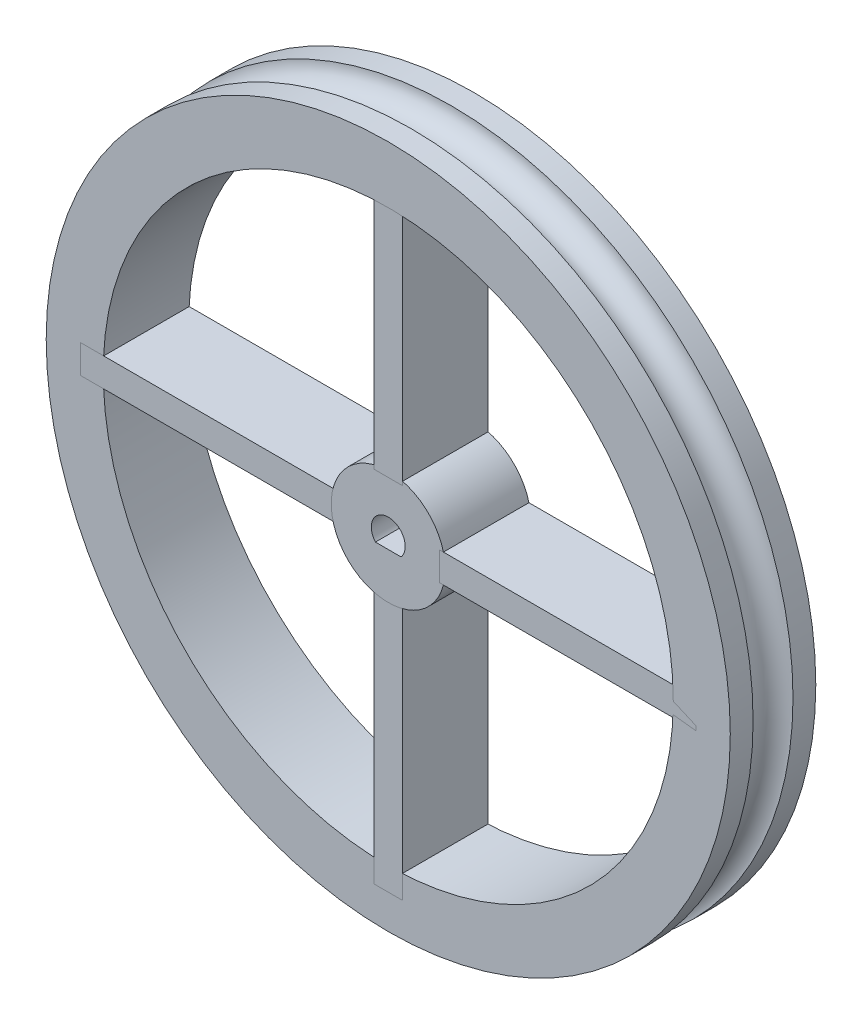
ISO-10303-21;
HEADER;
FILE_DESCRIPTION(('STEP AP214'),'2;1');
FILE_NAME('part.step','',(''),(''),'','','');
FILE_SCHEMA(('AUTOMOTIVE_DESIGN { 1 0 10303 214 1 1 1 1 }'));
ENDSEC;
DATA;
#1=APPLICATION_CONTEXT('core data for automotive mechanical design processes');
#2=APPLICATION_PROTOCOL_DEFINITION('international standard','automotive_design',2000,#1);
#3=PRODUCT_CONTEXT('',#1,'mechanical');
#4=PRODUCT('Part','Part','',(#3));
#5=PRODUCT_RELATED_PRODUCT_CATEGORY('part','',(#4));
#6=PRODUCT_DEFINITION_FORMATION('','',#4);
#7=PRODUCT_DEFINITION_CONTEXT('part definition',#1,'design');
#8=PRODUCT_DEFINITION('design','',#6,#7);
#9=PRODUCT_DEFINITION_SHAPE('','',#8);
#10=(LENGTH_UNIT() NAMED_UNIT(*) SI_UNIT(.MILLI.,.METRE.));
#11=(NAMED_UNIT(*) PLANE_ANGLE_UNIT() SI_UNIT($,.RADIAN.));
#12=(NAMED_UNIT(*) SI_UNIT($,.STERADIAN.) SOLID_ANGLE_UNIT());
#13=UNCERTAINTY_MEASURE_WITH_UNIT(LENGTH_MEASURE(1.E-05),#10,'distance_accuracy_value','');
#14=(GEOMETRIC_REPRESENTATION_CONTEXT(3) GLOBAL_UNCERTAINTY_ASSIGNED_CONTEXT((#13)) GLOBAL_UNIT_ASSIGNED_CONTEXT((#10,
#11,#12)) REPRESENTATION_CONTEXT('',''));
#15=CARTESIAN_POINT('',(0.,0.,0.));
#16=DIRECTION('',(0.,0.,1.));
#17=DIRECTION('',(1.,0.,0.));
#18=AXIS2_PLACEMENT_3D('',#15,#16,#17);
#19=CARTESIAN_POINT('',(27.432,0.,3.81));
#20=DIRECTION('',(1.,0.,0.));
#21=DIRECTION('',(0.,0.,-1.));
#22=AXIS2_PLACEMENT_3D('',#19,#20,#21);
#23=PLANE('',#22);
#24=DIRECTION('',(0.,-1.,0.));
#25=VECTOR('',#24,1.);
#26=CARTESIAN_POINT('',(27.432,0.,-3.81));
#27=LINE('',#26,#25);
#28=CARTESIAN_POINT('',(27.432,1.27,-3.81));
#29=VERTEX_POINT('',#28);
#30=CARTESIAN_POINT('',(27.432,-1.27,-3.81));
#31=VERTEX_POINT('',#30);
#32=EDGE_CURVE('P0_E102',#29,#31,#27,.T.);
#33=ORIENTED_EDGE('',*,*,#32,.F.);
#34=DIRECTION('',(0.,0.,-1.));
#35=VECTOR('',#34,1.);
#36=CARTESIAN_POINT('',(27.432,1.27,3.81));
#37=LINE('',#36,#35);
#38=CARTESIAN_POINT('',(27.432,1.27,3.81));
#39=VERTEX_POINT('',#38);
#40=EDGE_CURVE('P0_E11',#39,#29,#37,.T.);
#41=ORIENTED_EDGE('',*,*,#40,.F.);
#42=DIRECTION('',(0.,-1.,0.));
#43=VECTOR('',#42,1.);
#44=CARTESIAN_POINT('',(27.432,0.,3.81));
#45=LINE('',#44,#43);
#46=CARTESIAN_POINT('',(27.432,-1.27,3.81));
#47=VERTEX_POINT('',#46);
#48=EDGE_CURVE('P0_E80',#39,#47,#45,.T.);
#49=ORIENTED_EDGE('',*,*,#48,.T.);
#50=DIRECTION('',(0.,0.,-1.));
#51=VECTOR('',#50,1.);
#52=CARTESIAN_POINT('',(27.432,-1.27,3.81));
#53=LINE('',#52,#51);
#54=EDGE_CURVE('P0_E39',#47,#31,#53,.T.);
#55=ORIENTED_EDGE('',*,*,#54,.T.);
#56=EDGE_LOOP('',(#33,#41,#49,#55));
#57=FACE_BOUND('',#56,.T.);
#58=ADVANCED_FACE('P0_F17',(#57),#23,.T.);
#59=CARTESIAN_POINT('',(16.002,1.27,3.81));
#60=DIRECTION('',(0.,-1.,0.));
#61=DIRECTION('',(1.,0.,0.));
#62=AXIS2_PLACEMENT_3D('',#59,#60,#61);
#63=PLANE('',#62);
#64=DIRECTION('',(-1.,0.,0.));
#65=VECTOR('',#64,1.);
#66=CARTESIAN_POINT('',(16.002,1.27,-3.81));
#67=LINE('',#66,#65);
#68=CARTESIAN_POINT('',(4.572,1.27,-3.81));
#69=VERTEX_POINT('',#68);
#70=EDGE_CURVE('P0_E87',#29,#69,#67,.T.);
#71=ORIENTED_EDGE('',*,*,#70,.T.);
#72=DIRECTION('',(0.,0.,-1.));
#73=VECTOR('',#72,1.);
#74=CARTESIAN_POINT('',(4.572,1.27,3.81));
#75=LINE('',#74,#73);
#76=CARTESIAN_POINT('',(4.572,1.27,3.81));
#77=VERTEX_POINT('',#76);
#78=EDGE_CURVE('P0_E26',#77,#69,#75,.T.);
#79=ORIENTED_EDGE('',*,*,#78,.F.);
#80=DIRECTION('',(-1.,0.,0.));
#81=VECTOR('',#80,1.);
#82=CARTESIAN_POINT('',(16.002,1.27,3.81));
#83=LINE('',#82,#81);
#84=EDGE_CURVE('P0_E74',#39,#77,#83,.T.);
#85=ORIENTED_EDGE('',*,*,#84,.F.);
#86=ORIENTED_EDGE('',*,*,#40,.T.);
#87=EDGE_LOOP('',(#71,#79,#85,#86));
#88=FACE_BOUND('',#87,.T.);
#89=ADVANCED_FACE('P0_F85',(#88),#63,.F.);
#90=CARTESIAN_POINT('',(4.572,0.,3.81));
#91=DIRECTION('',(1.,0.,0.));
#92=DIRECTION('',(0.,0.,-1.));
#93=AXIS2_PLACEMENT_3D('',#90,#91,#92);
#94=PLANE('',#93);
#95=DIRECTION('',(0.,-1.,0.));
#96=VECTOR('',#95,1.);
#97=CARTESIAN_POINT('',(4.572,0.,-3.81));
#98=LINE('',#97,#96);
#99=CARTESIAN_POINT('',(4.572,-1.27,-3.81));
#100=VERTEX_POINT('',#99);
#101=EDGE_CURVE('P0_E107',#69,#100,#98,.T.);
#102=ORIENTED_EDGE('',*,*,#101,.T.);
#103=DIRECTION('',(0.,0.,-1.));
#104=VECTOR('',#103,1.);
#105=CARTESIAN_POINT('',(4.572,-1.27,3.81));
#106=LINE('',#105,#104);
#107=CARTESIAN_POINT('',(4.572,-1.27,3.81));
#108=VERTEX_POINT('',#107);
#109=EDGE_CURVE('P0_E57',#108,#100,#106,.T.);
#110=ORIENTED_EDGE('',*,*,#109,.F.);
#111=DIRECTION('',(0.,-1.,0.));
#112=VECTOR('',#111,1.);
#113=CARTESIAN_POINT('',(4.572,0.,3.81));
#114=LINE('',#113,#112);
#115=EDGE_CURVE('P0_E79',#77,#108,#114,.T.);
#116=ORIENTED_EDGE('',*,*,#115,.F.);
#117=ORIENTED_EDGE('',*,*,#78,.T.);
#118=EDGE_LOOP('',(#102,#110,#116,#117));
#119=FACE_BOUND('',#118,.T.);
#120=ADVANCED_FACE('P0_F91',(#119),#94,.F.);
#121=CARTESIAN_POINT('',(16.002,-1.27,3.81));
#122=DIRECTION('',(0.,-1.,0.));
#123=DIRECTION('',(1.,0.,0.));
#124=AXIS2_PLACEMENT_3D('',#121,#122,#123);
#125=PLANE('',#124);
#126=DIRECTION('',(-1.,0.,0.));
#127=VECTOR('',#126,1.);
#128=CARTESIAN_POINT('',(16.002,-1.27,-3.81));
#129=LINE('',#128,#127);
#130=EDGE_CURVE('P0_E109',#31,#100,#129,.T.);
#131=ORIENTED_EDGE('',*,*,#130,.F.);
#132=ORIENTED_EDGE('',*,*,#54,.F.);
#133=DIRECTION('',(-1.,0.,0.));
#134=VECTOR('',#133,1.);
#135=CARTESIAN_POINT('',(16.002,-1.27,3.81));
#136=LINE('',#135,#134);
#137=EDGE_CURVE('P0_E93',#47,#108,#136,.T.);
#138=ORIENTED_EDGE('',*,*,#137,.T.);
#139=ORIENTED_EDGE('',*,*,#109,.T.);
#140=EDGE_LOOP('',(#131,#132,#138,#139));
#141=FACE_BOUND('',#140,.T.);
#142=ADVANCED_FACE('P0_F128',(#141),#125,.T.);
#143=CARTESIAN_POINT('',(0.,0.,3.81));
#144=DIRECTION('',(0.,0.,1.));
#145=DIRECTION('',(1.,0.,0.));
#146=AXIS2_PLACEMENT_3D('',#143,#144,#145);
#147=PLANE('',#146);
#148=ORIENTED_EDGE('',*,*,#48,.F.);
#149=ORIENTED_EDGE('',*,*,#84,.T.);
#150=ORIENTED_EDGE('',*,*,#115,.T.);
#151=ORIENTED_EDGE('',*,*,#137,.F.);
#152=EDGE_LOOP('',(#148,#149,#150,#151));
#153=FACE_BOUND('',#152,.T.);
#154=ADVANCED_FACE('P0_F76',(#153),#147,.T.);
#155=CARTESIAN_POINT('',(0.,0.,-3.81));
#156=DIRECTION('',(0.,0.,1.));
#157=DIRECTION('',(1.,0.,0.));
#158=AXIS2_PLACEMENT_3D('',#155,#156,#157);
#159=PLANE('',#158);
#160=ORIENTED_EDGE('',*,*,#32,.T.);
#161=ORIENTED_EDGE('',*,*,#130,.T.);
#162=ORIENTED_EDGE('',*,*,#101,.F.);
#163=ORIENTED_EDGE('',*,*,#70,.F.);
#164=EDGE_LOOP('',(#160,#161,#162,#163));
#165=FACE_BOUND('',#164,.T.);
#166=ADVANCED_FACE('P0_F136',(#165),#159,.F.);
#167=CLOSED_SHELL('',(#58,#89,#120,#142,#154,#166));
#168=MANIFOLD_SOLID_BREP('P0_B1',#167);
#169=CARTESIAN_POINT('',(-4.572,0.,3.81));
#170=DIRECTION('',(1.,0.,0.));
#171=DIRECTION('',(0.,1.,0.));
#172=AXIS2_PLACEMENT_3D('',#169,#170,#171);
#173=PLANE('',#172);
#174=DIRECTION('',(0.,-1.,0.));
#175=VECTOR('',#174,1.);
#176=CARTESIAN_POINT('',(-4.572,0.,-3.81));
#177=LINE('',#176,#175);
#178=CARTESIAN_POINT('',(-4.572,1.27,-3.81));
#179=VERTEX_POINT('',#178);
#180=CARTESIAN_POINT('',(-4.572,-1.27,-3.81));
#181=VERTEX_POINT('',#180);
#182=EDGE_CURVE('P1_E102',#179,#181,#177,.T.);
#183=ORIENTED_EDGE('',*,*,#182,.F.);
#184=DIRECTION('',(0.,0.,-1.));
#185=VECTOR('',#184,1.);
#186=CARTESIAN_POINT('',(-4.572,1.27,3.81));
#187=LINE('',#186,#185);
#188=CARTESIAN_POINT('',(-4.572,1.27,3.81));
#189=VERTEX_POINT('',#188);
#190=EDGE_CURVE('P1_E11',#189,#179,#187,.T.);
#191=ORIENTED_EDGE('',*,*,#190,.F.);
#192=DIRECTION('',(0.,-1.,0.));
#193=VECTOR('',#192,1.);
#194=CARTESIAN_POINT('',(-4.572,0.,3.81));
#195=LINE('',#194,#193);
#196=CARTESIAN_POINT('',(-4.572,-1.27,3.81));
#197=VERTEX_POINT('',#196);
#198=EDGE_CURVE('P1_E80',#189,#197,#195,.T.);
#199=ORIENTED_EDGE('',*,*,#198,.T.);
#200=DIRECTION('',(0.,0.,-1.));
#201=VECTOR('',#200,1.);
#202=CARTESIAN_POINT('',(-4.572,-1.27,3.81));
#203=LINE('',#202,#201);
#204=EDGE_CURVE('P1_E39',#197,#181,#203,.T.);
#205=ORIENTED_EDGE('',*,*,#204,.T.);
#206=EDGE_LOOP('',(#183,#191,#199,#205));
#207=FACE_BOUND('',#206,.T.);
#208=ADVANCED_FACE('P1_F17',(#207),#173,.T.);
#209=CARTESIAN_POINT('',(-16.002,1.27,3.81));
#210=DIRECTION('',(0.,-1.,0.));
#211=DIRECTION('',(1.,0.,0.));
#212=AXIS2_PLACEMENT_3D('',#209,#210,#211);
#213=PLANE('',#212);
#214=DIRECTION('',(-1.,0.,0.));
#215=VECTOR('',#214,1.);
#216=CARTESIAN_POINT('',(-16.002,1.27,-3.81));
#217=LINE('',#216,#215);
#218=CARTESIAN_POINT('',(-27.432,1.27,-3.81));
#219=VERTEX_POINT('',#218);
#220=EDGE_CURVE('P1_E87',#179,#219,#217,.T.);
#221=ORIENTED_EDGE('',*,*,#220,.T.);
#222=DIRECTION('',(0.,0.,-1.));
#223=VECTOR('',#222,1.);
#224=CARTESIAN_POINT('',(-27.432,1.27,3.81));
#225=LINE('',#224,#223);
#226=CARTESIAN_POINT('',(-27.432,1.27,3.81));
#227=VERTEX_POINT('',#226);
#228=EDGE_CURVE('P1_E26',#227,#219,#225,.T.);
#229=ORIENTED_EDGE('',*,*,#228,.F.);
#230=DIRECTION('',(-1.,0.,0.));
#231=VECTOR('',#230,1.);
#232=CARTESIAN_POINT('',(-16.002,1.27,3.81));
#233=LINE('',#232,#231);
#234=EDGE_CURVE('P1_E74',#189,#227,#233,.T.);
#235=ORIENTED_EDGE('',*,*,#234,.F.);
#236=ORIENTED_EDGE('',*,*,#190,.T.);
#237=EDGE_LOOP('',(#221,#229,#235,#236));
#238=FACE_BOUND('',#237,.T.);
#239=ADVANCED_FACE('P1_F85',(#238),#213,.F.);
#240=CARTESIAN_POINT('',(-27.432,0.,3.81));
#241=DIRECTION('',(1.,0.,0.));
#242=DIRECTION('',(0.,0.,-1.));
#243=AXIS2_PLACEMENT_3D('',#240,#241,#242);
#244=PLANE('',#243);
#245=DIRECTION('',(0.,-1.,0.));
#246=VECTOR('',#245,1.);
#247=CARTESIAN_POINT('',(-27.432,0.,-3.81));
#248=LINE('',#247,#246);
#249=CARTESIAN_POINT('',(-27.432,-1.27000000000003,-3.81));
#250=VERTEX_POINT('',#249);
#251=EDGE_CURVE('P1_E107',#219,#250,#248,.T.);
#252=ORIENTED_EDGE('',*,*,#251,.T.);
#253=DIRECTION('',(0.,0.,-1.));
#254=VECTOR('',#253,1.);
#255=CARTESIAN_POINT('',(-27.432,-1.27000000000003,3.81));
#256=LINE('',#255,#254);
#257=CARTESIAN_POINT('',(-27.432,-1.27000000000003,3.81));
#258=VERTEX_POINT('',#257);
#259=EDGE_CURVE('P1_E57',#258,#250,#256,.T.);
#260=ORIENTED_EDGE('',*,*,#259,.F.);
#261=DIRECTION('',(0.,-1.,0.));
#262=VECTOR('',#261,1.);
#263=CARTESIAN_POINT('',(-27.432,0.,3.81));
#264=LINE('',#263,#262);
#265=EDGE_CURVE('P1_E79',#227,#258,#264,.T.);
#266=ORIENTED_EDGE('',*,*,#265,.F.);
#267=ORIENTED_EDGE('',*,*,#228,.T.);
#268=EDGE_LOOP('',(#252,#260,#266,#267));
#269=FACE_BOUND('',#268,.T.);
#270=ADVANCED_FACE('P1_F91',(#269),#244,.F.);
#271=CARTESIAN_POINT('',(-16.002,-1.27,3.81));
#272=DIRECTION('',(0.,-1.,0.));
#273=DIRECTION('',(1.,0.,0.));
#274=AXIS2_PLACEMENT_3D('',#271,#272,#273);
#275=PLANE('',#274);
#276=DIRECTION('',(-1.,0.,0.));
#277=VECTOR('',#276,1.);
#278=CARTESIAN_POINT('',(-16.002,-1.27,-3.81));
#279=LINE('',#278,#277);
#280=EDGE_CURVE('P1_E109',#181,#250,#279,.T.);
#281=ORIENTED_EDGE('',*,*,#280,.F.);
#282=ORIENTED_EDGE('',*,*,#204,.F.);
#283=DIRECTION('',(-1.,0.,0.));
#284=VECTOR('',#283,1.);
#285=CARTESIAN_POINT('',(-16.002,-1.27,3.81));
#286=LINE('',#285,#284);
#287=EDGE_CURVE('P1_E93',#197,#258,#286,.T.);
#288=ORIENTED_EDGE('',*,*,#287,.T.);
#289=ORIENTED_EDGE('',*,*,#259,.T.);
#290=EDGE_LOOP('',(#281,#282,#288,#289));
#291=FACE_BOUND('',#290,.T.);
#292=ADVANCED_FACE('P1_F128',(#291),#275,.T.);
#293=CARTESIAN_POINT('',(0.,0.,3.81));
#294=DIRECTION('',(0.,0.,1.));
#295=DIRECTION('',(1.,0.,0.));
#296=AXIS2_PLACEMENT_3D('',#293,#294,#295);
#297=PLANE('',#296);
#298=ORIENTED_EDGE('',*,*,#198,.F.);
#299=ORIENTED_EDGE('',*,*,#234,.T.);
#300=ORIENTED_EDGE('',*,*,#265,.T.);
#301=ORIENTED_EDGE('',*,*,#287,.F.);
#302=EDGE_LOOP('',(#298,#299,#300,#301));
#303=FACE_BOUND('',#302,.T.);
#304=ADVANCED_FACE('P1_F76',(#303),#297,.T.);
#305=CARTESIAN_POINT('',(0.,0.,-3.81));
#306=DIRECTION('',(0.,0.,1.));
#307=DIRECTION('',(1.,0.,0.));
#308=AXIS2_PLACEMENT_3D('',#305,#306,#307);
#309=PLANE('',#308);
#310=ORIENTED_EDGE('',*,*,#182,.T.);
#311=ORIENTED_EDGE('',*,*,#280,.T.);
#312=ORIENTED_EDGE('',*,*,#251,.F.);
#313=ORIENTED_EDGE('',*,*,#220,.F.);
#314=EDGE_LOOP('',(#310,#311,#312,#313));
#315=FACE_BOUND('',#314,.T.);
#316=ADVANCED_FACE('P1_F136',(#315),#309,.F.);
#317=CLOSED_SHELL('',(#208,#239,#270,#292,#304,#316));
#318=MANIFOLD_SOLID_BREP('P1_B1',#317);
#319=CARTESIAN_POINT('',(1.27,-16.002,3.81));
#320=DIRECTION('',(1.,0.,0.));
#321=DIRECTION('',(0.,1.,0.));
#322=AXIS2_PLACEMENT_3D('',#319,#320,#321);
#323=PLANE('',#322);
#324=DIRECTION('',(0.,-1.,0.));
#325=VECTOR('',#324,1.);
#326=CARTESIAN_POINT('',(1.27,-16.002,-3.81));
#327=LINE('',#326,#325);
#328=CARTESIAN_POINT('',(1.27,-4.572,-3.81));
#329=VERTEX_POINT('',#328);
#330=CARTESIAN_POINT('',(1.27000000000001,-27.432,-3.81));
#331=VERTEX_POINT('',#330);
#332=EDGE_CURVE('P2_E102',#329,#331,#327,.T.);
#333=ORIENTED_EDGE('',*,*,#332,.F.);
#334=DIRECTION('',(0.,0.,-1.));
#335=VECTOR('',#334,1.);
#336=CARTESIAN_POINT('',(1.27,-4.572,3.81));
#337=LINE('',#336,#335);
#338=CARTESIAN_POINT('',(1.27,-4.572,3.81));
#339=VERTEX_POINT('',#338);
#340=EDGE_CURVE('P2_E11',#339,#329,#337,.T.);
#341=ORIENTED_EDGE('',*,*,#340,.F.);
#342=DIRECTION('',(0.,-1.,0.));
#343=VECTOR('',#342,1.);
#344=CARTESIAN_POINT('',(1.27,-16.002,3.81));
#345=LINE('',#344,#343);
#346=CARTESIAN_POINT('',(1.27000000000001,-27.432,3.81));
#347=VERTEX_POINT('',#346);
#348=EDGE_CURVE('P2_E80',#339,#347,#345,.T.);
#349=ORIENTED_EDGE('',*,*,#348,.T.);
#350=DIRECTION('',(0.,0.,-1.));
#351=VECTOR('',#350,1.);
#352=CARTESIAN_POINT('',(1.27000000000001,-27.432,3.81));
#353=LINE('',#352,#351);
#354=EDGE_CURVE('P2_E39',#347,#331,#353,.T.);
#355=ORIENTED_EDGE('',*,*,#354,.T.);
#356=EDGE_LOOP('',(#333,#341,#349,#355));
#357=FACE_BOUND('',#356,.T.);
#358=ADVANCED_FACE('P2_F17',(#357),#323,.T.);
#359=CARTESIAN_POINT('',(0.,-4.572,3.81));
#360=DIRECTION('',(0.,-1.,0.));
#361=DIRECTION('',(0.,0.,-1.));
#362=AXIS2_PLACEMENT_3D('',#359,#360,#361);
#363=PLANE('',#362);
#364=DIRECTION('',(-1.,0.,0.));
#365=VECTOR('',#364,1.);
#366=CARTESIAN_POINT('',(0.,-4.572,-3.81));
#367=LINE('',#366,#365);
#368=CARTESIAN_POINT('',(-1.27,-4.572,-3.81));
#369=VERTEX_POINT('',#368);
#370=EDGE_CURVE('P2_E87',#329,#369,#367,.T.);
#371=ORIENTED_EDGE('',*,*,#370,.T.);
#372=DIRECTION('',(0.,0.,-1.));
#373=VECTOR('',#372,1.);
#374=CARTESIAN_POINT('',(-1.27,-4.572,3.81));
#375=LINE('',#374,#373);
#376=CARTESIAN_POINT('',(-1.27,-4.572,3.81));
#377=VERTEX_POINT('',#376);
#378=EDGE_CURVE('P2_E26',#377,#369,#375,.T.);
#379=ORIENTED_EDGE('',*,*,#378,.F.);
#380=DIRECTION('',(-1.,0.,0.));
#381=VECTOR('',#380,1.);
#382=CARTESIAN_POINT('',(0.,-4.572,3.81));
#383=LINE('',#382,#381);
#384=EDGE_CURVE('P2_E74',#339,#377,#383,.T.);
#385=ORIENTED_EDGE('',*,*,#384,.F.);
#386=ORIENTED_EDGE('',*,*,#340,.T.);
#387=EDGE_LOOP('',(#371,#379,#385,#386));
#388=FACE_BOUND('',#387,.T.);
#389=ADVANCED_FACE('P2_F85',(#388),#363,.F.);
#390=CARTESIAN_POINT('',(-1.27,-16.002,3.81));
#391=DIRECTION('',(1.,0.,0.));
#392=DIRECTION('',(0.,1.,0.));
#393=AXIS2_PLACEMENT_3D('',#390,#391,#392);
#394=PLANE('',#393);
#395=DIRECTION('',(0.,-1.,0.));
#396=VECTOR('',#395,1.);
#397=CARTESIAN_POINT('',(-1.27,-16.002,-3.81));
#398=LINE('',#397,#396);
#399=CARTESIAN_POINT('',(-1.27,-27.432,-3.81));
#400=VERTEX_POINT('',#399);
#401=EDGE_CURVE('P2_E107',#369,#400,#398,.T.);
#402=ORIENTED_EDGE('',*,*,#401,.T.);
#403=DIRECTION('',(0.,0.,-1.));
#404=VECTOR('',#403,1.);
#405=CARTESIAN_POINT('',(-1.27,-27.432,3.81));
#406=LINE('',#405,#404);
#407=CARTESIAN_POINT('',(-1.27,-27.432,3.81));
#408=VERTEX_POINT('',#407);
#409=EDGE_CURVE('P2_E57',#408,#400,#406,.T.);
#410=ORIENTED_EDGE('',*,*,#409,.F.);
#411=DIRECTION('',(0.,-1.,0.));
#412=VECTOR('',#411,1.);
#413=CARTESIAN_POINT('',(-1.27,-16.002,3.81));
#414=LINE('',#413,#412);
#415=EDGE_CURVE('P2_E79',#377,#408,#414,.T.);
#416=ORIENTED_EDGE('',*,*,#415,.F.);
#417=ORIENTED_EDGE('',*,*,#378,.T.);
#418=EDGE_LOOP('',(#402,#410,#416,#417));
#419=FACE_BOUND('',#418,.T.);
#420=ADVANCED_FACE('P2_F91',(#419),#394,.F.);
#421=CARTESIAN_POINT('',(0.,-27.432,3.81));
#422=DIRECTION('',(0.,-1.,0.));
#423=DIRECTION('',(0.,0.,-1.));
#424=AXIS2_PLACEMENT_3D('',#421,#422,#423);
#425=PLANE('',#424);
#426=DIRECTION('',(-1.,0.,0.));
#427=VECTOR('',#426,1.);
#428=CARTESIAN_POINT('',(0.,-27.432,-3.81));
#429=LINE('',#428,#427);
#430=EDGE_CURVE('P2_E109',#331,#400,#429,.T.);
#431=ORIENTED_EDGE('',*,*,#430,.F.);
#432=ORIENTED_EDGE('',*,*,#354,.F.);
#433=DIRECTION('',(-1.,0.,0.));
#434=VECTOR('',#433,1.);
#435=CARTESIAN_POINT('',(0.,-27.432,3.81));
#436=LINE('',#435,#434);
#437=EDGE_CURVE('P2_E93',#347,#408,#436,.T.);
#438=ORIENTED_EDGE('',*,*,#437,.T.);
#439=ORIENTED_EDGE('',*,*,#409,.T.);
#440=EDGE_LOOP('',(#431,#432,#438,#439));
#441=FACE_BOUND('',#440,.T.);
#442=ADVANCED_FACE('P2_F128',(#441),#425,.T.);
#443=CARTESIAN_POINT('',(0.,0.,3.81));
#444=DIRECTION('',(0.,0.,1.));
#445=DIRECTION('',(1.,0.,0.));
#446=AXIS2_PLACEMENT_3D('',#443,#444,#445);
#447=PLANE('',#446);
#448=ORIENTED_EDGE('',*,*,#348,.F.);
#449=ORIENTED_EDGE('',*,*,#384,.T.);
#450=ORIENTED_EDGE('',*,*,#415,.T.);
#451=ORIENTED_EDGE('',*,*,#437,.F.);
#452=EDGE_LOOP('',(#448,#449,#450,#451));
#453=FACE_BOUND('',#452,.T.);
#454=ADVANCED_FACE('P2_F76',(#453),#447,.T.);
#455=CARTESIAN_POINT('',(0.,0.,-3.81));
#456=DIRECTION('',(0.,0.,1.));
#457=DIRECTION('',(1.,0.,0.));
#458=AXIS2_PLACEMENT_3D('',#455,#456,#457);
#459=PLANE('',#458);
#460=ORIENTED_EDGE('',*,*,#332,.T.);
#461=ORIENTED_EDGE('',*,*,#430,.T.);
#462=ORIENTED_EDGE('',*,*,#401,.F.);
#463=ORIENTED_EDGE('',*,*,#370,.F.);
#464=EDGE_LOOP('',(#460,#461,#462,#463));
#465=FACE_BOUND('',#464,.T.);
#466=ADVANCED_FACE('P2_F136',(#465),#459,.F.);
#467=CLOSED_SHELL('',(#358,#389,#420,#442,#454,#466));
#468=MANIFOLD_SOLID_BREP('P2_B1',#467);
#469=CARTESIAN_POINT('',(1.27,16.002,3.81));
#470=DIRECTION('',(1.,0.,0.));
#471=DIRECTION('',(0.,1.,0.));
#472=AXIS2_PLACEMENT_3D('',#469,#470,#471);
#473=PLANE('',#472);
#474=DIRECTION('',(0.,-1.,0.));
#475=VECTOR('',#474,1.);
#476=CARTESIAN_POINT('',(1.27,16.002,-3.81));
#477=LINE('',#476,#475);
#478=CARTESIAN_POINT('',(1.27,27.432,-3.81));
#479=VERTEX_POINT('',#478);
#480=CARTESIAN_POINT('',(1.27,4.572,-3.81));
#481=VERTEX_POINT('',#480);
#482=EDGE_CURVE('P3_E102',#479,#481,#477,.T.);
#483=ORIENTED_EDGE('',*,*,#482,.F.);
#484=DIRECTION('',(0.,0.,-1.));
#485=VECTOR('',#484,1.);
#486=CARTESIAN_POINT('',(1.27,27.432,3.81));
#487=LINE('',#486,#485);
#488=CARTESIAN_POINT('',(1.27,27.432,3.81));
#489=VERTEX_POINT('',#488);
#490=EDGE_CURVE('P3_E11',#489,#479,#487,.T.);
#491=ORIENTED_EDGE('',*,*,#490,.F.);
#492=DIRECTION('',(0.,-1.,0.));
#493=VECTOR('',#492,1.);
#494=CARTESIAN_POINT('',(1.27,16.002,3.81));
#495=LINE('',#494,#493);
#496=CARTESIAN_POINT('',(1.27,4.572,3.81));
#497=VERTEX_POINT('',#496);
#498=EDGE_CURVE('P3_E80',#489,#497,#495,.T.);
#499=ORIENTED_EDGE('',*,*,#498,.T.);
#500=DIRECTION('',(0.,0.,-1.));
#501=VECTOR('',#500,1.);
#502=CARTESIAN_POINT('',(1.27,4.572,3.81));
#503=LINE('',#502,#501);
#504=EDGE_CURVE('P3_E39',#497,#481,#503,.T.);
#505=ORIENTED_EDGE('',*,*,#504,.T.);
#506=EDGE_LOOP('',(#483,#491,#499,#505));
#507=FACE_BOUND('',#506,.T.);
#508=ADVANCED_FACE('P3_F17',(#507),#473,.T.);
#509=CARTESIAN_POINT('',(0.,27.432,3.81));
#510=DIRECTION('',(0.,-1.,0.));
#511=DIRECTION('',(0.,0.,-1.));
#512=AXIS2_PLACEMENT_3D('',#509,#510,#511);
#513=PLANE('',#512);
#514=DIRECTION('',(-1.,0.,0.));
#515=VECTOR('',#514,1.);
#516=CARTESIAN_POINT('',(0.,27.432,-3.81));
#517=LINE('',#516,#515);
#518=CARTESIAN_POINT('',(-1.27000000000001,27.432,-3.81));
#519=VERTEX_POINT('',#518);
#520=EDGE_CURVE('P3_E87',#479,#519,#517,.T.);
#521=ORIENTED_EDGE('',*,*,#520,.T.);
#522=DIRECTION('',(0.,0.,-1.));
#523=VECTOR('',#522,1.);
#524=CARTESIAN_POINT('',(-1.27000000000001,27.432,3.81));
#525=LINE('',#524,#523);
#526=CARTESIAN_POINT('',(-1.27000000000001,27.432,3.81));
#527=VERTEX_POINT('',#526);
#528=EDGE_CURVE('P3_E26',#527,#519,#525,.T.);
#529=ORIENTED_EDGE('',*,*,#528,.F.);
#530=DIRECTION('',(-1.,0.,0.));
#531=VECTOR('',#530,1.);
#532=CARTESIAN_POINT('',(0.,27.432,3.81));
#533=LINE('',#532,#531);
#534=EDGE_CURVE('P3_E74',#489,#527,#533,.T.);
#535=ORIENTED_EDGE('',*,*,#534,.F.);
#536=ORIENTED_EDGE('',*,*,#490,.T.);
#537=EDGE_LOOP('',(#521,#529,#535,#536));
#538=FACE_BOUND('',#537,.T.);
#539=ADVANCED_FACE('P3_F85',(#538),#513,.F.);
#540=CARTESIAN_POINT('',(-1.27,16.002,3.81));
#541=DIRECTION('',(1.,0.,0.));
#542=DIRECTION('',(0.,1.,0.));
#543=AXIS2_PLACEMENT_3D('',#540,#541,#542);
#544=PLANE('',#543);
#545=DIRECTION('',(0.,-1.,0.));
#546=VECTOR('',#545,1.);
#547=CARTESIAN_POINT('',(-1.27,16.002,-3.81));
#548=LINE('',#547,#546);
#549=CARTESIAN_POINT('',(-1.27,4.572,-3.81));
#550=VERTEX_POINT('',#549);
#551=EDGE_CURVE('P3_E107',#519,#550,#548,.T.);
#552=ORIENTED_EDGE('',*,*,#551,.T.);
#553=DIRECTION('',(0.,0.,-1.));
#554=VECTOR('',#553,1.);
#555=CARTESIAN_POINT('',(-1.27,4.572,3.81));
#556=LINE('',#555,#554);
#557=CARTESIAN_POINT('',(-1.27,4.572,3.81));
#558=VERTEX_POINT('',#557);
#559=EDGE_CURVE('P3_E57',#558,#550,#556,.T.);
#560=ORIENTED_EDGE('',*,*,#559,.F.);
#561=DIRECTION('',(0.,-1.,0.));
#562=VECTOR('',#561,1.);
#563=CARTESIAN_POINT('',(-1.27,16.002,3.81));
#564=LINE('',#563,#562);
#565=EDGE_CURVE('P3_E79',#527,#558,#564,.T.);
#566=ORIENTED_EDGE('',*,*,#565,.F.);
#567=ORIENTED_EDGE('',*,*,#528,.T.);
#568=EDGE_LOOP('',(#552,#560,#566,#567));
#569=FACE_BOUND('',#568,.T.);
#570=ADVANCED_FACE('P3_F91',(#569),#544,.F.);
#571=CARTESIAN_POINT('',(0.,4.572,3.81));
#572=DIRECTION('',(0.,-1.,0.));
#573=DIRECTION('',(0.,0.,-1.));
#574=AXIS2_PLACEMENT_3D('',#571,#572,#573);
#575=PLANE('',#574);
#576=DIRECTION('',(-1.,0.,0.));
#577=VECTOR('',#576,1.);
#578=CARTESIAN_POINT('',(0.,4.572,-3.81));
#579=LINE('',#578,#577);
#580=EDGE_CURVE('P3_E109',#481,#550,#579,.T.);
#581=ORIENTED_EDGE('',*,*,#580,.F.);
#582=ORIENTED_EDGE('',*,*,#504,.F.);
#583=DIRECTION('',(-1.,0.,0.));
#584=VECTOR('',#583,1.);
#585=CARTESIAN_POINT('',(0.,4.572,3.81));
#586=LINE('',#585,#584);
#587=EDGE_CURVE('P3_E93',#497,#558,#586,.T.);
#588=ORIENTED_EDGE('',*,*,#587,.T.);
#589=ORIENTED_EDGE('',*,*,#559,.T.);
#590=EDGE_LOOP('',(#581,#582,#588,#589));
#591=FACE_BOUND('',#590,.T.);
#592=ADVANCED_FACE('P3_F128',(#591),#575,.T.);
#593=CARTESIAN_POINT('',(0.,0.,3.81));
#594=DIRECTION('',(0.,0.,1.));
#595=DIRECTION('',(1.,0.,0.));
#596=AXIS2_PLACEMENT_3D('',#593,#594,#595);
#597=PLANE('',#596);
#598=ORIENTED_EDGE('',*,*,#498,.F.);
#599=ORIENTED_EDGE('',*,*,#534,.T.);
#600=ORIENTED_EDGE('',*,*,#565,.T.);
#601=ORIENTED_EDGE('',*,*,#587,.F.);
#602=EDGE_LOOP('',(#598,#599,#600,#601));
#603=FACE_BOUND('',#602,.T.);
#604=ADVANCED_FACE('P3_F76',(#603),#597,.T.);
#605=CARTESIAN_POINT('',(0.,0.,-3.81));
#606=DIRECTION('',(0.,0.,1.));
#607=DIRECTION('',(1.,0.,0.));
#608=AXIS2_PLACEMENT_3D('',#605,#606,#607);
#609=PLANE('',#608);
#610=ORIENTED_EDGE('',*,*,#482,.T.);
#611=ORIENTED_EDGE('',*,*,#580,.T.);
#612=ORIENTED_EDGE('',*,*,#551,.F.);
#613=ORIENTED_EDGE('',*,*,#520,.F.);
#614=EDGE_LOOP('',(#610,#611,#612,#613));
#615=FACE_BOUND('',#614,.T.);
#616=ADVANCED_FACE('P3_F136',(#615),#609,.F.);
#617=CLOSED_SHELL('',(#508,#539,#570,#592,#604,#616));
#618=MANIFOLD_SOLID_BREP('P3_B1',#617);
#619=CARTESIAN_POINT('',(27.94,0.,3.81));
#620=DIRECTION('',(0.,0.,-1.));
#621=DIRECTION('',(-1.,0.,0.));
#622=AXIS2_PLACEMENT_3D('',#619,#620,#621);
#623=PLANE('',#622);
#624=CARTESIAN_POINT('',(0.,0.,3.81));
#625=DIRECTION('',(0.,0.,1.));
#626=DIRECTION('',(1.,0.,0.));
#627=AXIS2_PLACEMENT_3D('',#624,#625,#626);
#628=CIRCLE('',#627,25.4);
#629=CARTESIAN_POINT('',(25.4,0.,3.81));
#630=VERTEX_POINT('',#629);
#631=EDGE_CURVE('P4_E10',#630,#630,#628,.T.);
#632=ORIENTED_EDGE('',*,*,#631,.F.);
#633=EDGE_LOOP('',(#632));
#634=FACE_BOUND('',#633,.T.);
#635=CARTESIAN_POINT('',(0.,0.,3.81));
#636=DIRECTION('',(0.,0.,1.));
#637=DIRECTION('',(1.,0.,0.));
#638=AXIS2_PLACEMENT_3D('',#635,#636,#637);
#639=CIRCLE('',#638,30.48);
#640=CARTESIAN_POINT('',(30.48,0.,3.81));
#641=VERTEX_POINT('',#640);
#642=EDGE_CURVE('P4_E46',#641,#641,#639,.T.);
#643=ORIENTED_EDGE('',*,*,#642,.T.);
#644=EDGE_LOOP('',(#643));
#645=FACE_BOUND('',#644,.T.);
#646=ADVANCED_FACE('P4_F15',(#634,#645),#623,.F.);
#647=CARTESIAN_POINT('',(0.,0.,-1.20952397471688));
#648=DIRECTION('',(0.,0.,1.));
#649=DIRECTION('',(1.,0.,0.));
#650=AXIS2_PLACEMENT_3D('',#647,#648,#649);
#651=CYLINDRICAL_SURFACE('',#650,25.4);
#652=CARTESIAN_POINT('',(0.,0.,-3.81));
#653=DIRECTION('',(0.,0.,1.));
#654=DIRECTION('',(1.,0.,0.));
#655=AXIS2_PLACEMENT_3D('',#652,#653,#654);
#656=CIRCLE('',#655,25.4);
#657=CARTESIAN_POINT('',(25.4,0.,-3.81));
#658=VERTEX_POINT('',#657);
#659=EDGE_CURVE('P4_E22',#658,#658,#656,.T.);
#660=ORIENTED_EDGE('',*,*,#659,.F.);
#661=EDGE_LOOP('',(#660));
#662=FACE_BOUND('',#661,.T.);
#663=ORIENTED_EDGE('',*,*,#631,.T.);
#664=EDGE_LOOP('',(#663));
#665=FACE_BOUND('',#664,.T.);
#666=ADVANCED_FACE('P4_F65',(#662,#665),#651,.F.);
#667=CARTESIAN_POINT('',(27.94,0.,-3.81));
#668=DIRECTION('',(0.,0.,-1.));
#669=DIRECTION('',(-1.,0.,0.));
#670=AXIS2_PLACEMENT_3D('',#667,#668,#669);
#671=PLANE('',#670);
#672=ORIENTED_EDGE('',*,*,#659,.T.);
#673=EDGE_LOOP('',(#672));
#674=FACE_BOUND('',#673,.T.);
#675=CARTESIAN_POINT('',(0.,0.,-3.81));
#676=DIRECTION('',(0.,0.,1.));
#677=DIRECTION('',(1.,0.,0.));
#678=AXIS2_PLACEMENT_3D('',#675,#676,#677);
#679=CIRCLE('',#678,30.48);
#680=CARTESIAN_POINT('',(30.48,0.,-3.81));
#681=VERTEX_POINT('',#680);
#682=EDGE_CURVE('P4_E31',#681,#681,#679,.T.);
#683=ORIENTED_EDGE('',*,*,#682,.F.);
#684=EDGE_LOOP('',(#683));
#685=FACE_BOUND('',#684,.T.);
#686=ADVANCED_FACE('P4_F70',(#674,#685),#671,.T.);
#687=CARTESIAN_POINT('',(0.,0.,-1.20952397471688));
#688=DIRECTION('',(0.,0.,1.));
#689=DIRECTION('',(1.,0.,0.));
#690=AXIS2_PLACEMENT_3D('',#687,#688,#689);
#691=CYLINDRICAL_SURFACE('',#690,30.48);
#692=ORIENTED_EDGE('',*,*,#682,.T.);
#693=EDGE_LOOP('',(#692));
#694=FACE_BOUND('',#693,.T.);
#695=CARTESIAN_POINT('',(0.,0.,-1.778));
#696=DIRECTION('',(0.,0.,1.));
#697=DIRECTION('',(1.,0.,0.));
#698=AXIS2_PLACEMENT_3D('',#695,#696,#697);
#699=CIRCLE('',#698,30.48);
#700=CARTESIAN_POINT('',(30.48,0.,-1.778));
#701=VERTEX_POINT('',#700);
#702=EDGE_CURVE('P4_E37',#701,#701,#699,.T.);
#703=ORIENTED_EDGE('',*,*,#702,.F.);
#704=EDGE_LOOP('',(#703));
#705=FACE_BOUND('',#704,.T.);
#706=ADVANCED_FACE('P4_F61',(#694,#705),#691,.T.);
#707=CARTESIAN_POINT('',(0.,0.,0.));
#708=DIRECTION('',(0.,0.,1.));
#709=DIRECTION('',(1.,0.,0.));
#710=AXIS2_PLACEMENT_3D('',#707,#708,#709);
#711=TOROIDAL_SURFACE('',#710,30.48,1.778);
#712=ORIENTED_EDGE('',*,*,#702,.T.);
#713=EDGE_LOOP('',(#712));
#714=FACE_BOUND('',#713,.T.);
#715=CARTESIAN_POINT('',(0.,0.,1.778));
#716=DIRECTION('',(0.,0.,1.));
#717=DIRECTION('',(1.,0.,0.));
#718=AXIS2_PLACEMENT_3D('',#715,#716,#717);
#719=CIRCLE('',#718,30.48);
#720=CARTESIAN_POINT('',(30.48,0.,1.778));
#721=VERTEX_POINT('',#720);
#722=EDGE_CURVE('P4_E43',#721,#721,#719,.T.);
#723=ORIENTED_EDGE('',*,*,#722,.F.);
#724=EDGE_LOOP('',(#723));
#725=FACE_BOUND('',#724,.T.);
#726=ADVANCED_FACE('P4_F54',(#714,#725),#711,.F.);
#727=CARTESIAN_POINT('',(0.,0.,-1.20952397471688));
#728=DIRECTION('',(0.,0.,1.));
#729=DIRECTION('',(1.,0.,0.));
#730=AXIS2_PLACEMENT_3D('',#727,#728,#729);
#731=CYLINDRICAL_SURFACE('',#730,30.48);
#732=ORIENTED_EDGE('',*,*,#722,.T.);
#733=EDGE_LOOP('',(#732));
#734=FACE_BOUND('',#733,.T.);
#735=ORIENTED_EDGE('',*,*,#642,.F.);
#736=EDGE_LOOP('',(#735));
#737=FACE_BOUND('',#736,.T.);
#738=ADVANCED_FACE('P4_F52',(#734,#737),#731,.T.);
#739=CLOSED_SHELL('',(#646,#666,#686,#706,#726,#738));
#740=MANIFOLD_SOLID_BREP('P4_B1',#739);
#741=CARTESIAN_POINT('',(0.,0.,-3.81));
#742=DIRECTION('',(0.,0.,1.));
#743=DIRECTION('',(1.,0.,0.));
#744=AXIS2_PLACEMENT_3D('',#741,#742,#743);
#745=CYLINDRICAL_SURFACE('',#744,1.5113);
#746=CARTESIAN_POINT('',(0.,0.,3.81));
#747=DIRECTION('',(0.,0.,1.));
#748=DIRECTION('',(1.,0.,0.));
#749=AXIS2_PLACEMENT_3D('',#746,#747,#748);
#750=CIRCLE('',#749,1.5113);
#751=CARTESIAN_POINT('',(1.143,-0.988725791106917,3.81));
#752=VERTEX_POINT('',#751);
#753=CARTESIAN_POINT('',(-1.143,-0.988725791106917,3.81));
#754=VERTEX_POINT('',#753);
#755=EDGE_CURVE('P5_E59',#752,#754,#750,.T.);
#756=ORIENTED_EDGE('',*,*,#755,.T.);
#757=DIRECTION('',(0.,0.,1.));
#758=VECTOR('',#757,1.);
#759=CARTESIAN_POINT('',(-1.143,-0.988725791106917,-3.81));
#760=LINE('',#759,#758);
#761=CARTESIAN_POINT('',(-1.143,-0.988725791106917,-3.81));
#762=VERTEX_POINT('',#761);
#763=EDGE_CURVE('P5_E25',#762,#754,#760,.T.);
#764=ORIENTED_EDGE('',*,*,#763,.F.);
#765=CARTESIAN_POINT('',(0.,0.,-3.81));
#766=DIRECTION('',(0.,0.,1.));
#767=DIRECTION('',(1.,0.,0.));
#768=AXIS2_PLACEMENT_3D('',#765,#766,#767);
#769=CIRCLE('',#768,1.5113);
#770=CARTESIAN_POINT('',(1.143,-0.988725791106917,-3.81));
#771=VERTEX_POINT('',#770);
#772=EDGE_CURVE('P5_E73',#771,#762,#769,.T.);
#773=ORIENTED_EDGE('',*,*,#772,.F.);
#774=DIRECTION('',(0.,0.,1.));
#775=VECTOR('',#774,1.);
#776=CARTESIAN_POINT('',(1.143,-0.988725791106917,-3.81));
#777=LINE('',#776,#775);
#778=EDGE_CURVE('P5_E10',#771,#752,#777,.T.);
#779=ORIENTED_EDGE('',*,*,#778,.T.);
#780=EDGE_LOOP('',(#756,#764,#773,#779));
#781=FACE_BOUND('',#780,.T.);
#782=ADVANCED_FACE('P5_F16',(#781),#745,.F.);
#783=CARTESIAN_POINT('',(0.,-0.988725791106917,-3.81));
#784=DIRECTION('',(0.,-1.,0.));
#785=DIRECTION('',(1.,0.,0.));
#786=AXIS2_PLACEMENT_3D('',#783,#784,#785);
#787=PLANE('',#786);
#788=DIRECTION('',(1.,0.,0.));
#789=VECTOR('',#788,1.);
#790=CARTESIAN_POINT('',(0.,-0.988725791106917,3.81));
#791=LINE('',#790,#789);
#792=EDGE_CURVE('P5_E49',#754,#752,#791,.T.);
#793=ORIENTED_EDGE('',*,*,#792,.T.);
#794=ORIENTED_EDGE('',*,*,#778,.F.);
#795=DIRECTION('',(1.,0.,0.));
#796=VECTOR('',#795,1.);
#797=CARTESIAN_POINT('',(0.,-0.988725791106917,-3.81));
#798=LINE('',#797,#796);
#799=EDGE_CURVE('P5_E52',#762,#771,#798,.T.);
#800=ORIENTED_EDGE('',*,*,#799,.F.);
#801=ORIENTED_EDGE('',*,*,#763,.T.);
#802=EDGE_LOOP('',(#793,#794,#800,#801));
#803=FACE_BOUND('',#802,.T.);
#804=ADVANCED_FACE('P5_F48',(#803),#787,.F.);
#805=CARTESIAN_POINT('',(0.,0.,-3.81));
#806=DIRECTION('',(0.,0.,1.));
#807=DIRECTION('',(1.,0.,0.));
#808=AXIS2_PLACEMENT_3D('',#805,#806,#807);
#809=CYLINDRICAL_SURFACE('',#808,5.08);
#810=CARTESIAN_POINT('',(0.,0.,-3.81));
#811=DIRECTION('',(0.,0.,1.));
#812=DIRECTION('',(1.,0.,0.));
#813=AXIS2_PLACEMENT_3D('',#810,#811,#812);
#814=CIRCLE('',#813,5.08);
#815=CARTESIAN_POINT('',(5.08,0.,-3.81));
#816=VERTEX_POINT('',#815);
#817=EDGE_CURVE('P5_E55',#816,#816,#814,.T.);
#818=ORIENTED_EDGE('',*,*,#817,.T.);
#819=EDGE_LOOP('',(#818));
#820=FACE_BOUND('',#819,.T.);
#821=CARTESIAN_POINT('',(0.,0.,3.81));
#822=DIRECTION('',(0.,0.,1.));
#823=DIRECTION('',(1.,0.,0.));
#824=AXIS2_PLACEMENT_3D('',#821,#822,#823);
#825=CIRCLE('',#824,5.08);
#826=CARTESIAN_POINT('',(5.08,0.,3.81));
#827=VERTEX_POINT('',#826);
#828=EDGE_CURVE('P5_E61',#827,#827,#825,.T.);
#829=ORIENTED_EDGE('',*,*,#828,.F.);
#830=EDGE_LOOP('',(#829));
#831=FACE_BOUND('',#830,.T.);
#832=ADVANCED_FACE('P5_F86',(#820,#831),#809,.T.);
#833=CARTESIAN_POINT('',(0.,0.,-3.81));
#834=DIRECTION('',(0.,0.,1.));
#835=DIRECTION('',(1.,0.,0.));
#836=AXIS2_PLACEMENT_3D('',#833,#834,#835);
#837=PLANE('',#836);
#838=ORIENTED_EDGE('',*,*,#772,.T.);
#839=ORIENTED_EDGE('',*,*,#799,.T.);
#840=EDGE_LOOP('',(#838,#839));
#841=FACE_BOUND('',#840,.T.);
#842=ORIENTED_EDGE('',*,*,#817,.F.);
#843=EDGE_LOOP('',(#842));
#844=FACE_BOUND('',#843,.T.);
#845=ADVANCED_FACE('P5_F89',(#841,#844),#837,.F.);
#846=CARTESIAN_POINT('',(0.,0.,3.81));
#847=DIRECTION('',(0.,0.,1.));
#848=DIRECTION('',(1.,0.,0.));
#849=AXIS2_PLACEMENT_3D('',#846,#847,#848);
#850=PLANE('',#849);
#851=ORIENTED_EDGE('',*,*,#755,.F.);
#852=ORIENTED_EDGE('',*,*,#792,.F.);
#853=EDGE_LOOP('',(#851,#852));
#854=FACE_BOUND('',#853,.T.);
#855=ORIENTED_EDGE('',*,*,#828,.T.);
#856=EDGE_LOOP('',(#855));
#857=FACE_BOUND('',#856,.T.);
#858=ADVANCED_FACE('P5_F57',(#854,#857),#850,.T.);
#859=CLOSED_SHELL('',(#782,#804,#832,#845,#858));
#860=MANIFOLD_SOLID_BREP('P5_B1',#859);
#861=ADVANCED_BREP_SHAPE_REPRESENTATION('',(#18,#168,#318,#468,#618,#740,#860),#14);
#862=SHAPE_DEFINITION_REPRESENTATION(#9,#861);
ENDSEC;
END-ISO-10303-21;
